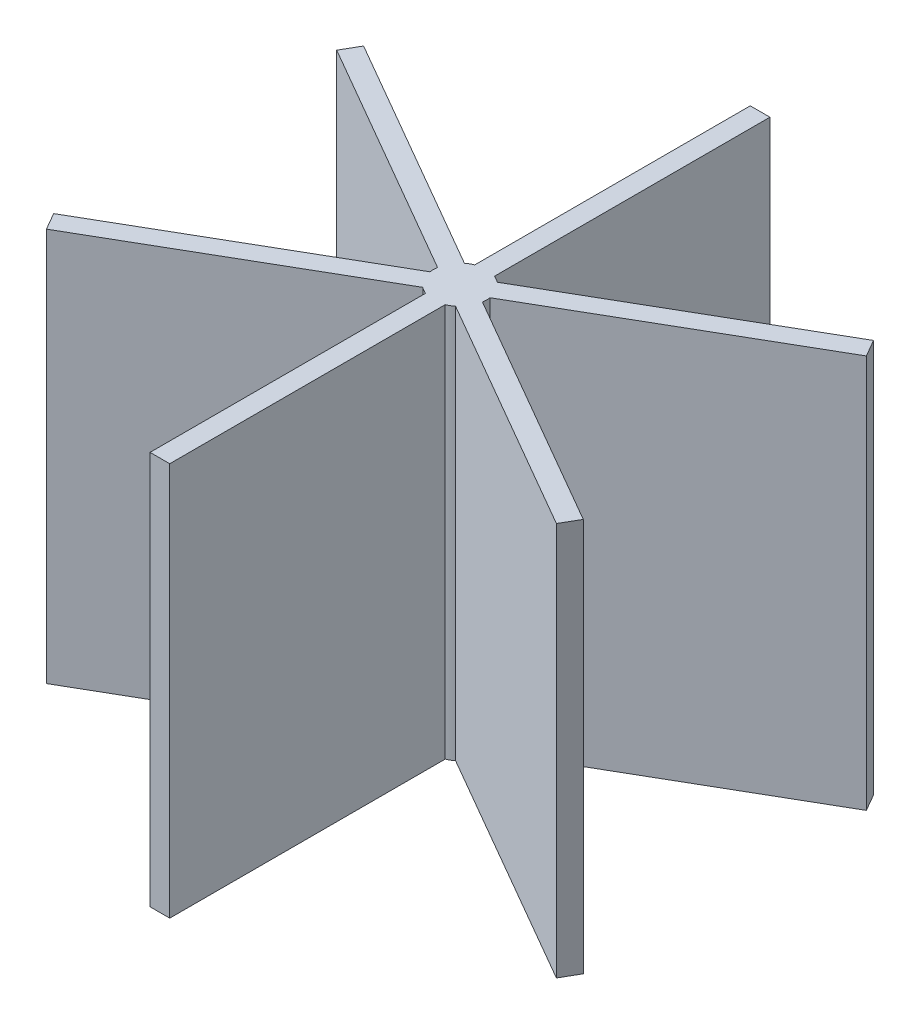
ISO-10303-21;
HEADER;
FILE_DESCRIPTION(('STEP AP214'),'2;1');
FILE_NAME('part.step','',(''),(''),'','','');
FILE_SCHEMA(('AUTOMOTIVE_DESIGN { 1 0 10303 214 1 1 1 1 }'));
ENDSEC;
DATA;
#1=APPLICATION_CONTEXT('core data for automotive mechanical design processes');
#2=APPLICATION_PROTOCOL_DEFINITION('international standard','automotive_design',2000,#1);
#3=PRODUCT_CONTEXT('',#1,'mechanical');
#4=PRODUCT('Part','Part','',(#3));
#5=PRODUCT_RELATED_PRODUCT_CATEGORY('part','',(#4));
#6=PRODUCT_DEFINITION_FORMATION('','',#4);
#7=PRODUCT_DEFINITION_CONTEXT('part definition',#1,'design');
#8=PRODUCT_DEFINITION('design','',#6,#7);
#9=PRODUCT_DEFINITION_SHAPE('','',#8);
#10=(LENGTH_UNIT() NAMED_UNIT(*) SI_UNIT(.MILLI.,.METRE.));
#11=(NAMED_UNIT(*) PLANE_ANGLE_UNIT() SI_UNIT($,.RADIAN.));
#12=(NAMED_UNIT(*) SI_UNIT($,.STERADIAN.) SOLID_ANGLE_UNIT());
#13=UNCERTAINTY_MEASURE_WITH_UNIT(LENGTH_MEASURE(1.E-05),#10,'distance_accuracy_value','');
#14=(GEOMETRIC_REPRESENTATION_CONTEXT(3) GLOBAL_UNCERTAINTY_ASSIGNED_CONTEXT((#13)) GLOBAL_UNIT_ASSIGNED_CONTEXT((#10,
#11,#12)) REPRESENTATION_CONTEXT('',''));
#15=CARTESIAN_POINT('',(0.,0.,0.));
#16=DIRECTION('',(0.,0.,1.));
#17=DIRECTION('',(1.,0.,0.));
#18=AXIS2_PLACEMENT_3D('',#15,#16,#17);
#19=CARTESIAN_POINT('',(0.,50.8,0.));
#20=DIRECTION('',(0.,-1.,0.));
#21=DIRECTION('',(0.,0.,-1.));
#22=AXIS2_PLACEMENT_3D('',#19,#20,#21);
#23=CYLINDRICAL_SURFACE('',#22,3.4195796525316);
#24=CARTESIAN_POINT('',(0.,0.,0.));
#25=DIRECTION('',(0.,1.,0.));
#26=DIRECTION('',(0.,0.,1.));
#27=AXIS2_PLACEMENT_3D('',#24,#25,#26);
#28=CIRCLE('',#27,3.4195796525316);
#29=CARTESIAN_POINT('',(-1.2699999999999,0.,-3.1750000000014));
#30=VERTEX_POINT('',#29);
#31=CARTESIAN_POINT('',(-2.11463065701598,0.,-2.68735226280735));
#32=VERTEX_POINT('',#31);
#33=EDGE_CURVE('E225',#30,#32,#28,.T.);
#34=ORIENTED_EDGE('',*,*,#33,.T.);
#35=DIRECTION('',(0.,-1.,0.));
#36=VECTOR('',#35,1.);
#37=CARTESIAN_POINT('',(-2.11463065701598,50.8,-2.68735226280735));
#38=LINE('',#37,#36);
#39=CARTESIAN_POINT('',(-2.11463065701598,50.8,-2.68735226280735));
#40=VERTEX_POINT('',#39);
#41=EDGE_CURVE('E11',#40,#32,#38,.T.);
#42=ORIENTED_EDGE('',*,*,#41,.F.);
#43=CARTESIAN_POINT('',(0.,50.8,0.));
#44=DIRECTION('',(0.,1.,0.));
#45=DIRECTION('',(0.,0.,1.));
#46=AXIS2_PLACEMENT_3D('',#43,#44,#45);
#47=CIRCLE('',#46,3.4195796525316);
#48=CARTESIAN_POINT('',(-1.2699999999999,50.8,-3.1750000000014));
#49=VERTEX_POINT('',#48);
#50=EDGE_CURVE('E271',#49,#40,#47,.T.);
#51=ORIENTED_EDGE('',*,*,#50,.F.);
#52=DIRECTION('',(0.,-1.,0.));
#53=VECTOR('',#52,1.);
#54=CARTESIAN_POINT('',(-1.2699999999999,50.8,-3.1750000000014));
#55=LINE('',#54,#53);
#56=EDGE_CURVE('E221',#49,#30,#55,.T.);
#57=ORIENTED_EDGE('',*,*,#56,.T.);
#58=EDGE_LOOP('',(#34,#42,#51,#57));
#59=FACE_BOUND('',#58,.T.);
#60=ADVANCED_FACE('F33',(#59),#23,.T.);
#61=CARTESIAN_POINT('',(-2.11463065701598,50.8,-2.68735226280735));
#62=DIRECTION('',(-0.499999999999999,0.,0.866025403784439));
#63=DIRECTION('',(0.866025403784439,0.,0.499999999999999));
#64=AXIS2_PLACEMENT_3D('',#61,#62,#63);
#65=PLANE('',#64);
#66=DIRECTION('',(-0.866025403784439,0.,-0.499999999999999));
#67=VECTOR('',#66,1.);
#68=CARTESIAN_POINT('',(-2.11463065701598,0.,-2.68735226280735));
#69=LINE('',#68,#67);
#70=CARTESIAN_POINT('',(-32.9104940155906,0.,-20.4673522628073));
#71=VERTEX_POINT('',#70);
#72=EDGE_CURVE('E228',#32,#71,#69,.T.);
#73=ORIENTED_EDGE('',*,*,#72,.T.);
#74=DIRECTION('',(0.,-1.,0.));
#75=VECTOR('',#74,1.);
#76=CARTESIAN_POINT('',(-32.9104940155906,50.8,-20.4673522628073));
#77=LINE('',#76,#75);
#78=CARTESIAN_POINT('',(-32.9104940155906,50.8,-20.4673522628073));
#79=VERTEX_POINT('',#78);
#80=EDGE_CURVE('E41',#79,#71,#77,.T.);
#81=ORIENTED_EDGE('',*,*,#80,.F.);
#82=DIRECTION('',(-0.866025403784439,0.,-0.499999999999999));
#83=VECTOR('',#82,1.);
#84=CARTESIAN_POINT('',(-2.11463065701598,50.8,-2.68735226280735));
#85=LINE('',#84,#83);
#86=EDGE_CURVE('E140',#40,#79,#85,.T.);
#87=ORIENTED_EDGE('',*,*,#86,.F.);
#88=ORIENTED_EDGE('',*,*,#41,.T.);
#89=EDGE_LOOP('',(#73,#81,#87,#88));
#90=FACE_BOUND('',#89,.T.);
#91=ADVANCED_FACE('F409',(#90),#65,.F.);
#92=CARTESIAN_POINT('',(-34.1804940155906,50.8,-18.2676477371948));
#93=DIRECTION('',(0.866025403784439,0.,0.5));
#94=DIRECTION('',(0.5,0.,-0.866025403784439));
#95=AXIS2_PLACEMENT_3D('',#92,#93,#94);
#96=PLANE('',#95);
#97=DIRECTION('',(-0.5,0.,0.866025403784439));
#98=VECTOR('',#97,1.);
#99=CARTESIAN_POINT('',(-34.1804940155906,0.,-18.2676477371948));
#100=LINE('',#99,#98);
#101=CARTESIAN_POINT('',(-34.1804940155906,0.,-18.2676477371948));
#102=VERTEX_POINT('',#101);
#103=EDGE_CURVE('E230',#71,#102,#100,.T.);
#104=ORIENTED_EDGE('',*,*,#103,.T.);
#105=DIRECTION('',(0.,-1.,0.));
#106=VECTOR('',#105,1.);
#107=CARTESIAN_POINT('',(-34.1804940155906,50.8,-18.2676477371948));
#108=LINE('',#107,#106);
#109=CARTESIAN_POINT('',(-34.1804940155906,50.8,-18.2676477371948));
#110=VERTEX_POINT('',#109);
#111=EDGE_CURVE('E326',#110,#102,#108,.T.);
#112=ORIENTED_EDGE('',*,*,#111,.F.);
#113=DIRECTION('',(-0.5,0.,0.866025403784439));
#114=VECTOR('',#113,1.);
#115=CARTESIAN_POINT('',(-34.1804940155906,50.8,-18.2676477371948));
#116=LINE('',#115,#114);
#117=EDGE_CURVE('E334',#79,#110,#116,.T.);
#118=ORIENTED_EDGE('',*,*,#117,.F.);
#119=ORIENTED_EDGE('',*,*,#80,.T.);
#120=EDGE_LOOP('',(#104,#112,#118,#119));
#121=FACE_BOUND('',#120,.T.);
#122=ADVANCED_FACE('F332',(#121),#96,.F.);
#123=CARTESIAN_POINT('',(-3.38463065701598,50.8,-0.487647737194882));
#124=DIRECTION('',(0.499999999999999,0.,-0.866025403784439));
#125=DIRECTION('',(-0.866025403784439,0.,-0.499999999999999));
#126=AXIS2_PLACEMENT_3D('',#123,#124,#125);
#127=PLANE('',#126);
#128=DIRECTION('',(0.866025403784439,0.,0.499999999999999));
#129=VECTOR('',#128,1.);
#130=CARTESIAN_POINT('',(-3.38463065701598,0.,-0.487647737194882));
#131=LINE('',#130,#129);
#132=CARTESIAN_POINT('',(-3.38463065701587,0.,-0.487647737194866));
#133=VERTEX_POINT('',#132);
#134=EDGE_CURVE('E232',#102,#133,#131,.T.);
#135=ORIENTED_EDGE('',*,*,#134,.T.);
#136=DIRECTION('',(0.,-1.,0.));
#137=VECTOR('',#136,1.);
#138=CARTESIAN_POINT('',(-3.38463065701587,50.8,-0.487647737194866));
#139=LINE('',#138,#137);
#140=CARTESIAN_POINT('',(-3.38463065701587,50.8,-0.487647737194866));
#141=VERTEX_POINT('',#140);
#142=EDGE_CURVE('E323',#141,#133,#139,.T.);
#143=ORIENTED_EDGE('',*,*,#142,.F.);
#144=DIRECTION('',(0.866025403784439,0.,0.499999999999999));
#145=VECTOR('',#144,1.);
#146=CARTESIAN_POINT('',(-3.38463065701598,50.8,-0.487647737194882));
#147=LINE('',#146,#145);
#148=EDGE_CURVE('E352',#110,#141,#147,.T.);
#149=ORIENTED_EDGE('',*,*,#148,.F.);
#150=ORIENTED_EDGE('',*,*,#111,.T.);
#151=EDGE_LOOP('',(#135,#143,#149,#150));
#152=FACE_BOUND('',#151,.T.);
#153=ADVANCED_FACE('F343',(#152),#127,.F.);
#154=CARTESIAN_POINT('',(0.,50.8,0.));
#155=DIRECTION('',(0.,-1.,0.));
#156=DIRECTION('',(0.,0.,-1.));
#157=AXIS2_PLACEMENT_3D('',#154,#155,#156);
#158=CYLINDRICAL_SURFACE('',#157,3.41957965253084);
#159=CARTESIAN_POINT('',(0.,0.,0.));
#160=DIRECTION('',(0.,1.,0.));
#161=DIRECTION('',(0.,0.,1.));
#162=AXIS2_PLACEMENT_3D('',#159,#160,#161);
#163=CIRCLE('',#162,3.41957965253084);
#164=CARTESIAN_POINT('',(-3.38463065701598,0.,0.487647737193217));
#165=VERTEX_POINT('',#164);
#166=EDGE_CURVE('E234',#133,#165,#163,.T.);
#167=ORIENTED_EDGE('',*,*,#166,.T.);
#168=DIRECTION('',(0.,-1.,0.));
#169=VECTOR('',#168,1.);
#170=CARTESIAN_POINT('',(-3.38463065701598,50.8,0.487647737193217));
#171=LINE('',#170,#169);
#172=CARTESIAN_POINT('',(-3.38463065701598,50.8,0.487647737193217));
#173=VERTEX_POINT('',#172);
#174=EDGE_CURVE('E320',#173,#165,#171,.T.);
#175=ORIENTED_EDGE('',*,*,#174,.F.);
#176=CARTESIAN_POINT('',(0.,50.8,0.));
#177=DIRECTION('',(0.,1.,0.));
#178=DIRECTION('',(0.,0.,1.));
#179=AXIS2_PLACEMENT_3D('',#176,#177,#178);
#180=CIRCLE('',#179,3.41957965253084);
#181=EDGE_CURVE('E349',#141,#173,#180,.T.);
#182=ORIENTED_EDGE('',*,*,#181,.F.);
#183=ORIENTED_EDGE('',*,*,#142,.T.);
#184=EDGE_LOOP('',(#167,#175,#182,#183));
#185=FACE_BOUND('',#184,.T.);
#186=ADVANCED_FACE('F347',(#185),#158,.T.);
#187=CARTESIAN_POINT('',(-3.38463065701598,50.8,0.487647737193217));
#188=DIRECTION('',(0.5,0.,0.866025403784438));
#189=DIRECTION('',(0.866025403784438,0.,-0.500000000000001));
#190=AXIS2_PLACEMENT_3D('',#187,#188,#189);
#191=PLANE('',#190);
#192=DIRECTION('',(-0.866025403784438,0.,0.5));
#193=VECTOR('',#192,1.);
#194=CARTESIAN_POINT('',(-3.38463065701598,0.,0.487647737193217));
#195=LINE('',#194,#193);
#196=CARTESIAN_POINT('',(-34.1804940155906,0.,18.2676477371932));
#197=VERTEX_POINT('',#196);
#198=EDGE_CURVE('E236',#165,#197,#195,.T.);
#199=ORIENTED_EDGE('',*,*,#198,.T.);
#200=DIRECTION('',(0.,-1.,0.));
#201=VECTOR('',#200,1.);
#202=CARTESIAN_POINT('',(-34.1804940155906,50.8,18.2676477371932));
#203=LINE('',#202,#201);
#204=CARTESIAN_POINT('',(-34.1804940155906,50.8,18.2676477371932));
#205=VERTEX_POINT('',#204);
#206=EDGE_CURVE('E317',#205,#197,#203,.T.);
#207=ORIENTED_EDGE('',*,*,#206,.F.);
#208=DIRECTION('',(-0.866025403784438,0.,0.5));
#209=VECTOR('',#208,1.);
#210=CARTESIAN_POINT('',(-3.38463065701598,50.8,0.487647737193217));
#211=LINE('',#210,#209);
#212=EDGE_CURVE('E351',#173,#205,#211,.T.);
#213=ORIENTED_EDGE('',*,*,#212,.F.);
#214=ORIENTED_EDGE('',*,*,#174,.T.);
#215=EDGE_LOOP('',(#199,#207,#213,#214));
#216=FACE_BOUND('',#215,.T.);
#217=ADVANCED_FACE('F422',(#216),#191,.F.);
#218=CARTESIAN_POINT('',(-32.9104940155906,50.8,20.4673522628057));
#219=DIRECTION('',(0.866025403784439,0.,-0.5));
#220=DIRECTION('',(-0.5,0.,-0.866025403784439));
#221=AXIS2_PLACEMENT_3D('',#218,#219,#220);
#222=PLANE('',#221);
#223=DIRECTION('',(0.5,0.,0.866025403784439));
#224=VECTOR('',#223,1.);
#225=CARTESIAN_POINT('',(-32.9104940155906,0.,20.4673522628057));
#226=LINE('',#225,#224);
#227=CARTESIAN_POINT('',(-32.9104940155906,0.,20.4673522628057));
#228=VERTEX_POINT('',#227);
#229=EDGE_CURVE('E238',#197,#228,#226,.T.);
#230=ORIENTED_EDGE('',*,*,#229,.T.);
#231=DIRECTION('',(0.,-1.,0.));
#232=VECTOR('',#231,1.);
#233=CARTESIAN_POINT('',(-32.9104940155906,50.8,20.4673522628057));
#234=LINE('',#233,#232);
#235=CARTESIAN_POINT('',(-32.9104940155906,50.8,20.4673522628057));
#236=VERTEX_POINT('',#235);
#237=EDGE_CURVE('E314',#236,#228,#234,.T.);
#238=ORIENTED_EDGE('',*,*,#237,.F.);
#239=DIRECTION('',(0.5,0.,0.866025403784439));
#240=VECTOR('',#239,1.);
#241=CARTESIAN_POINT('',(-32.9104940155906,50.8,20.4673522628057));
#242=LINE('',#241,#240);
#243=EDGE_CURVE('E354',#205,#236,#242,.T.);
#244=ORIENTED_EDGE('',*,*,#243,.F.);
#245=ORIENTED_EDGE('',*,*,#206,.T.);
#246=EDGE_LOOP('',(#230,#238,#244,#245));
#247=FACE_BOUND('',#246,.T.);
#248=ADVANCED_FACE('F425',(#247),#222,.F.);
#249=CARTESIAN_POINT('',(-2.11463065701598,50.8,2.68735226280569));
#250=DIRECTION('',(-0.5,0.,-0.866025403784438));
#251=DIRECTION('',(-0.866025403784438,0.,0.500000000000001));
#252=AXIS2_PLACEMENT_3D('',#249,#250,#251);
#253=PLANE('',#252);
#254=DIRECTION('',(0.866025403784438,0.,-0.5));
#255=VECTOR('',#254,1.);
#256=CARTESIAN_POINT('',(-2.11463065701598,0.,2.68735226280569));
#257=LINE('',#256,#255);
#258=CARTESIAN_POINT('',(-2.11463065701595,0.,2.68735226280565));
#259=VERTEX_POINT('',#258);
#260=EDGE_CURVE('E240',#228,#259,#257,.T.);
#261=ORIENTED_EDGE('',*,*,#260,.T.);
#262=DIRECTION('',(0.,-1.,0.));
#263=VECTOR('',#262,1.);
#264=CARTESIAN_POINT('',(-2.11463065701595,50.8,2.68735226280565));
#265=LINE('',#264,#263);
#266=CARTESIAN_POINT('',(-2.11463065701595,50.8,2.68735226280565));
#267=VERTEX_POINT('',#266);
#268=EDGE_CURVE('E311',#267,#259,#265,.T.);
#269=ORIENTED_EDGE('',*,*,#268,.F.);
#270=DIRECTION('',(0.866025403784438,0.,-0.5));
#271=VECTOR('',#270,1.);
#272=CARTESIAN_POINT('',(-2.11463065701598,50.8,2.68735226280569));
#273=LINE('',#272,#271);
#274=EDGE_CURVE('E360',#236,#267,#273,.T.);
#275=ORIENTED_EDGE('',*,*,#274,.F.);
#276=ORIENTED_EDGE('',*,*,#237,.T.);
#277=EDGE_LOOP('',(#261,#269,#275,#276));
#278=FACE_BOUND('',#277,.T.);
#279=ADVANCED_FACE('F429',(#278),#253,.F.);
#280=CARTESIAN_POINT('',(0.,50.8,0.));
#281=DIRECTION('',(0.,-1.,0.));
#282=DIRECTION('',(0.,0.,-1.));
#283=AXIS2_PLACEMENT_3D('',#280,#281,#282);
#284=CYLINDRICAL_SURFACE('',#283,3.41957965253017);
#285=CARTESIAN_POINT('',(0.,0.,0.));
#286=DIRECTION('',(0.,1.,0.));
#287=DIRECTION('',(0.,0.,1.));
#288=AXIS2_PLACEMENT_3D('',#285,#286,#287);
#289=CIRCLE('',#288,3.41957965253017);
#290=CARTESIAN_POINT('',(-1.2699999999999,0.,3.17499999999973));
#291=VERTEX_POINT('',#290);
#292=EDGE_CURVE('E242',#259,#291,#289,.T.);
#293=ORIENTED_EDGE('',*,*,#292,.T.);
#294=DIRECTION('',(0.,-1.,0.));
#295=VECTOR('',#294,1.);
#296=CARTESIAN_POINT('',(-1.2699999999999,50.8,3.17499999999973));
#297=LINE('',#296,#295);
#298=CARTESIAN_POINT('',(-1.2699999999999,50.8,3.17499999999973));
#299=VERTEX_POINT('',#298);
#300=EDGE_CURVE('E308',#299,#291,#297,.T.);
#301=ORIENTED_EDGE('',*,*,#300,.F.);
#302=CARTESIAN_POINT('',(0.,50.8,0.));
#303=DIRECTION('',(0.,1.,0.));
#304=DIRECTION('',(0.,0.,1.));
#305=AXIS2_PLACEMENT_3D('',#302,#303,#304);
#306=CIRCLE('',#305,3.41957965253017);
#307=EDGE_CURVE('E362',#267,#299,#306,.T.);
#308=ORIENTED_EDGE('',*,*,#307,.F.);
#309=ORIENTED_EDGE('',*,*,#268,.T.);
#310=EDGE_LOOP('',(#293,#301,#308,#309));
#311=FACE_BOUND('',#310,.T.);
#312=ADVANCED_FACE('F433',(#311),#284,.T.);
#313=CARTESIAN_POINT('',(-1.2699999999999,50.8,3.17499999999973));
#314=DIRECTION('',(1.,0.,0.));
#315=DIRECTION('',(0.,0.,-1.));
#316=AXIS2_PLACEMENT_3D('',#313,#314,#315);
#317=PLANE('',#316);
#318=DIRECTION('',(0.,0.,1.));
#319=VECTOR('',#318,1.);
#320=CARTESIAN_POINT('',(-1.2699999999999,0.,3.17499999999973));
#321=LINE('',#320,#319);
#322=CARTESIAN_POINT('',(-1.26999999999988,0.,38.7349999999997));
#323=VERTEX_POINT('',#322);
#324=EDGE_CURVE('E244',#291,#323,#321,.T.);
#325=ORIENTED_EDGE('',*,*,#324,.T.);
#326=DIRECTION('',(0.,-1.,0.));
#327=VECTOR('',#326,1.);
#328=CARTESIAN_POINT('',(-1.26999999999988,50.8,38.7349999999997));
#329=LINE('',#328,#327);
#330=CARTESIAN_POINT('',(-1.26999999999988,50.8,38.7349999999997));
#331=VERTEX_POINT('',#330);
#332=EDGE_CURVE('E305',#331,#323,#329,.T.);
#333=ORIENTED_EDGE('',*,*,#332,.F.);
#334=DIRECTION('',(0.,0.,1.));
#335=VECTOR('',#334,1.);
#336=CARTESIAN_POINT('',(-1.2699999999999,50.8,3.17499999999973));
#337=LINE('',#336,#335);
#338=EDGE_CURVE('E364',#299,#331,#337,.T.);
#339=ORIENTED_EDGE('',*,*,#338,.F.);
#340=ORIENTED_EDGE('',*,*,#300,.T.);
#341=EDGE_LOOP('',(#325,#333,#339,#340));
#342=FACE_BOUND('',#341,.T.);
#343=ADVANCED_FACE('F437',(#342),#317,.F.);
#344=CARTESIAN_POINT('',(1.27000000000008,50.8,38.7349999999997));
#345=DIRECTION('',(0.,0.,-1.));
#346=DIRECTION('',(-1.,0.,0.));
#347=AXIS2_PLACEMENT_3D('',#344,#345,#346);
#348=PLANE('',#347);
#349=DIRECTION('',(1.,0.,0.));
#350=VECTOR('',#349,1.);
#351=CARTESIAN_POINT('',(1.27000000000008,0.,38.7349999999997));
#352=LINE('',#351,#350);
#353=CARTESIAN_POINT('',(1.27000000000008,0.,38.7349999999997));
#354=VERTEX_POINT('',#353);
#355=EDGE_CURVE('E246',#323,#354,#352,.T.);
#356=ORIENTED_EDGE('',*,*,#355,.T.);
#357=DIRECTION('',(0.,-1.,0.));
#358=VECTOR('',#357,1.);
#359=CARTESIAN_POINT('',(1.27000000000008,50.8,38.7349999999997));
#360=LINE('',#359,#358);
#361=CARTESIAN_POINT('',(1.27000000000008,50.8,38.7349999999997));
#362=VERTEX_POINT('',#361);
#363=EDGE_CURVE('E302',#362,#354,#360,.T.);
#364=ORIENTED_EDGE('',*,*,#363,.F.);
#365=DIRECTION('',(1.,0.,0.));
#366=VECTOR('',#365,1.);
#367=CARTESIAN_POINT('',(1.27000000000008,50.8,38.7349999999997));
#368=LINE('',#367,#366);
#369=EDGE_CURVE('E366',#331,#362,#368,.T.);
#370=ORIENTED_EDGE('',*,*,#369,.F.);
#371=ORIENTED_EDGE('',*,*,#332,.T.);
#372=EDGE_LOOP('',(#356,#364,#370,#371));
#373=FACE_BOUND('',#372,.T.);
#374=ADVANCED_FACE('F441',(#373),#348,.F.);
#375=CARTESIAN_POINT('',(1.2700000000001,50.8,3.17499999999973));
#376=DIRECTION('',(-1.,0.,0.));
#377=DIRECTION('',(0.,0.,1.));
#378=AXIS2_PLACEMENT_3D('',#375,#376,#377);
#379=PLANE('',#378);
#380=DIRECTION('',(0.,0.,-1.));
#381=VECTOR('',#380,1.);
#382=CARTESIAN_POINT('',(1.2700000000001,0.,3.17499999999973));
#383=LINE('',#382,#381);
#384=CARTESIAN_POINT('',(1.27000000000013,0.,3.1749999999998));
#385=VERTEX_POINT('',#384);
#386=EDGE_CURVE('E248',#354,#385,#383,.T.);
#387=ORIENTED_EDGE('',*,*,#386,.T.);
#388=DIRECTION('',(0.,-1.,0.));
#389=VECTOR('',#388,1.);
#390=CARTESIAN_POINT('',(1.27000000000013,50.8,3.1749999999998));
#391=LINE('',#390,#389);
#392=CARTESIAN_POINT('',(1.27000000000013,50.8,3.1749999999998));
#393=VERTEX_POINT('',#392);
#394=EDGE_CURVE('E299',#393,#385,#391,.T.);
#395=ORIENTED_EDGE('',*,*,#394,.F.);
#396=DIRECTION('',(0.,0.,-1.));
#397=VECTOR('',#396,1.);
#398=CARTESIAN_POINT('',(1.2700000000001,50.8,3.17499999999973));
#399=LINE('',#398,#397);
#400=EDGE_CURVE('E368',#362,#393,#399,.T.);
#401=ORIENTED_EDGE('',*,*,#400,.F.);
#402=ORIENTED_EDGE('',*,*,#363,.T.);
#403=EDGE_LOOP('',(#387,#395,#401,#402));
#404=FACE_BOUND('',#403,.T.);
#405=ADVANCED_FACE('F445',(#404),#379,.F.);
#406=CARTESIAN_POINT('',(0.,50.8,0.));
#407=DIRECTION('',(0.,-1.,0.));
#408=DIRECTION('',(0.,0.,-1.));
#409=AXIS2_PLACEMENT_3D('',#406,#407,#408);
#410=CYLINDRICAL_SURFACE('',#409,3.41957965253027);
#411=CARTESIAN_POINT('',(0.,0.,0.));
#412=DIRECTION('',(0.,1.,0.));
#413=DIRECTION('',(0.,0.,1.));
#414=AXIS2_PLACEMENT_3D('',#411,#412,#413);
#415=CIRCLE('',#414,3.41957965253027);
#416=CARTESIAN_POINT('',(2.11463065701618,0.,2.68735226280569));
#417=VERTEX_POINT('',#416);
#418=EDGE_CURVE('E250',#385,#417,#415,.T.);
#419=ORIENTED_EDGE('',*,*,#418,.T.);
#420=DIRECTION('',(0.,-1.,0.));
#421=VECTOR('',#420,1.);
#422=CARTESIAN_POINT('',(2.11463065701618,50.8,2.68735226280569));
#423=LINE('',#422,#421);
#424=CARTESIAN_POINT('',(2.11463065701618,50.8,2.68735226280569));
#425=VERTEX_POINT('',#424);
#426=EDGE_CURVE('E296',#425,#417,#423,.T.);
#427=ORIENTED_EDGE('',*,*,#426,.F.);
#428=CARTESIAN_POINT('',(0.,50.8,0.));
#429=DIRECTION('',(0.,1.,0.));
#430=DIRECTION('',(0.,0.,1.));
#431=AXIS2_PLACEMENT_3D('',#428,#429,#430);
#432=CIRCLE('',#431,3.41957965253027);
#433=EDGE_CURVE('E370',#393,#425,#432,.T.);
#434=ORIENTED_EDGE('',*,*,#433,.F.);
#435=ORIENTED_EDGE('',*,*,#394,.T.);
#436=EDGE_LOOP('',(#419,#427,#434,#435));
#437=FACE_BOUND('',#436,.T.);
#438=ADVANCED_FACE('F449',(#437),#410,.T.);
#439=CARTESIAN_POINT('',(2.11463065701618,50.8,2.68735226280569));
#440=DIRECTION('',(0.5,0.,-0.866025403784439));
#441=DIRECTION('',(-0.866025403784439,0.,-0.5));
#442=AXIS2_PLACEMENT_3D('',#439,#440,#441);
#443=PLANE('',#442);
#444=DIRECTION('',(0.866025403784439,0.,0.5));
#445=VECTOR('',#444,1.);
#446=CARTESIAN_POINT('',(2.11463065701618,0.,2.68735226280569));
#447=LINE('',#446,#445);
#448=CARTESIAN_POINT('',(32.9104940155908,0.,20.4673522628057));
#449=VERTEX_POINT('',#448);
#450=EDGE_CURVE('E252',#417,#449,#447,.T.);
#451=ORIENTED_EDGE('',*,*,#450,.T.);
#452=DIRECTION('',(0.,-1.,0.));
#453=VECTOR('',#452,1.);
#454=CARTESIAN_POINT('',(32.9104940155908,50.8,20.4673522628057));
#455=LINE('',#454,#453);
#456=CARTESIAN_POINT('',(32.9104940155908,50.8,20.4673522628057));
#457=VERTEX_POINT('',#456);
#458=EDGE_CURVE('E293',#457,#449,#455,.T.);
#459=ORIENTED_EDGE('',*,*,#458,.F.);
#460=DIRECTION('',(0.866025403784439,0.,0.5));
#461=VECTOR('',#460,1.);
#462=CARTESIAN_POINT('',(2.11463065701618,50.8,2.68735226280569));
#463=LINE('',#462,#461);
#464=EDGE_CURVE('E372',#425,#457,#463,.T.);
#465=ORIENTED_EDGE('',*,*,#464,.F.);
#466=ORIENTED_EDGE('',*,*,#426,.T.);
#467=EDGE_LOOP('',(#451,#459,#465,#466));
#468=FACE_BOUND('',#467,.T.);
#469=ADVANCED_FACE('F453',(#468),#443,.F.);
#470=CARTESIAN_POINT('',(34.1804940155908,50.8,18.2676477371932));
#471=DIRECTION('',(-0.866025403784439,0.,-0.5));
#472=DIRECTION('',(-0.5,0.,0.866025403784439));
#473=AXIS2_PLACEMENT_3D('',#470,#471,#472);
#474=PLANE('',#473);
#475=DIRECTION('',(0.5,0.,-0.866025403784439));
#476=VECTOR('',#475,1.);
#477=CARTESIAN_POINT('',(34.1804940155908,0.,18.2676477371932));
#478=LINE('',#477,#476);
#479=CARTESIAN_POINT('',(34.1804940155908,0.,18.2676477371932));
#480=VERTEX_POINT('',#479);
#481=EDGE_CURVE('E254',#449,#480,#478,.T.);
#482=ORIENTED_EDGE('',*,*,#481,.T.);
#483=DIRECTION('',(0.,-1.,0.));
#484=VECTOR('',#483,1.);
#485=CARTESIAN_POINT('',(34.1804940155908,50.8,18.2676477371932));
#486=LINE('',#485,#484);
#487=CARTESIAN_POINT('',(34.1804940155908,50.8,18.2676477371932));
#488=VERTEX_POINT('',#487);
#489=EDGE_CURVE('E290',#488,#480,#486,.T.);
#490=ORIENTED_EDGE('',*,*,#489,.F.);
#491=DIRECTION('',(0.5,0.,-0.866025403784439));
#492=VECTOR('',#491,1.);
#493=CARTESIAN_POINT('',(34.1804940155908,50.8,18.2676477371932));
#494=LINE('',#493,#492);
#495=EDGE_CURVE('E374',#457,#488,#494,.T.);
#496=ORIENTED_EDGE('',*,*,#495,.F.);
#497=ORIENTED_EDGE('',*,*,#458,.T.);
#498=EDGE_LOOP('',(#482,#490,#496,#497));
#499=FACE_BOUND('',#498,.T.);
#500=ADVANCED_FACE('F457',(#499),#474,.F.);
#501=CARTESIAN_POINT('',(3.38463065701619,50.8,0.487647737193217));
#502=DIRECTION('',(-0.5,0.,0.866025403784439));
#503=DIRECTION('',(0.866025403784439,0.,0.5));
#504=AXIS2_PLACEMENT_3D('',#501,#502,#503);
#505=PLANE('',#504);
#506=DIRECTION('',(-0.866025403784439,0.,-0.5));
#507=VECTOR('',#506,1.);
#508=CARTESIAN_POINT('',(3.38463065701619,0.,0.487647737193217));
#509=LINE('',#508,#507);
#510=CARTESIAN_POINT('',(3.3846306570163,0.,0.487647737193234));
#511=VERTEX_POINT('',#510);
#512=EDGE_CURVE('E256',#480,#511,#509,.T.);
#513=ORIENTED_EDGE('',*,*,#512,.T.);
#514=DIRECTION('',(0.,-1.,0.));
#515=VECTOR('',#514,1.);
#516=CARTESIAN_POINT('',(3.3846306570163,50.8,0.487647737193234));
#517=LINE('',#516,#515);
#518=CARTESIAN_POINT('',(3.3846306570163,50.8,0.487647737193234));
#519=VERTEX_POINT('',#518);
#520=EDGE_CURVE('E287',#519,#511,#517,.T.);
#521=ORIENTED_EDGE('',*,*,#520,.F.);
#522=DIRECTION('',(-0.866025403784439,0.,-0.5));
#523=VECTOR('',#522,1.);
#524=CARTESIAN_POINT('',(3.38463065701619,50.8,0.487647737193217));
#525=LINE('',#524,#523);
#526=EDGE_CURVE('E376',#488,#519,#525,.T.);
#527=ORIENTED_EDGE('',*,*,#526,.F.);
#528=ORIENTED_EDGE('',*,*,#489,.T.);
#529=EDGE_LOOP('',(#513,#521,#527,#528));
#530=FACE_BOUND('',#529,.T.);
#531=ADVANCED_FACE('F461',(#530),#505,.F.);
#532=CARTESIAN_POINT('',(0.,50.8,0.));
#533=DIRECTION('',(0.,-1.,0.));
#534=DIRECTION('',(0.,0.,-1.));
#535=AXIS2_PLACEMENT_3D('',#532,#533,#534);
#536=CYLINDRICAL_SURFACE('',#535,3.41957965253104);
#537=CARTESIAN_POINT('',(0.,0.,0.));
#538=DIRECTION('',(0.,1.,0.));
#539=DIRECTION('',(0.,0.,1.));
#540=AXIS2_PLACEMENT_3D('',#537,#538,#539);
#541=CIRCLE('',#540,3.41957965253104);
#542=CARTESIAN_POINT('',(3.38463065701619,0.,-0.487647737194882));
#543=VERTEX_POINT('',#542);
#544=EDGE_CURVE('E258',#511,#543,#541,.T.);
#545=ORIENTED_EDGE('',*,*,#544,.T.);
#546=DIRECTION('',(0.,-1.,0.));
#547=VECTOR('',#546,1.);
#548=CARTESIAN_POINT('',(3.38463065701619,50.8,-0.487647737194882));
#549=LINE('',#548,#547);
#550=CARTESIAN_POINT('',(3.38463065701619,50.8,-0.487647737194882));
#551=VERTEX_POINT('',#550);
#552=EDGE_CURVE('E284',#551,#543,#549,.T.);
#553=ORIENTED_EDGE('',*,*,#552,.F.);
#554=CARTESIAN_POINT('',(0.,50.8,0.));
#555=DIRECTION('',(0.,1.,0.));
#556=DIRECTION('',(0.,0.,1.));
#557=AXIS2_PLACEMENT_3D('',#554,#555,#556);
#558=CIRCLE('',#557,3.41957965253104);
#559=EDGE_CURVE('E378',#519,#551,#558,.T.);
#560=ORIENTED_EDGE('',*,*,#559,.F.);
#561=ORIENTED_EDGE('',*,*,#520,.T.);
#562=EDGE_LOOP('',(#545,#553,#560,#561));
#563=FACE_BOUND('',#562,.T.);
#564=ADVANCED_FACE('F465',(#563),#536,.T.);
#565=CARTESIAN_POINT('',(3.38463065701619,50.8,-0.487647737194882));
#566=DIRECTION('',(-0.5,0.,-0.866025403784438));
#567=DIRECTION('',(-0.866025403784439,0.,0.5));
#568=AXIS2_PLACEMENT_3D('',#565,#566,#567);
#569=PLANE('',#568);
#570=DIRECTION('',(0.866025403784438,0.,-0.5));
#571=VECTOR('',#570,1.);
#572=CARTESIAN_POINT('',(3.38463065701619,0.,-0.487647737194882));
#573=LINE('',#572,#571);
#574=CARTESIAN_POINT('',(34.1804940155908,0.,-18.2676477371949));
#575=VERTEX_POINT('',#574);
#576=EDGE_CURVE('E260',#543,#575,#573,.T.);
#577=ORIENTED_EDGE('',*,*,#576,.T.);
#578=DIRECTION('',(0.,-1.,0.));
#579=VECTOR('',#578,1.);
#580=CARTESIAN_POINT('',(34.1804940155908,50.8,-18.2676477371949));
#581=LINE('',#580,#579);
#582=CARTESIAN_POINT('',(34.1804940155908,50.8,-18.2676477371949));
#583=VERTEX_POINT('',#582);
#584=EDGE_CURVE('E281',#583,#575,#581,.T.);
#585=ORIENTED_EDGE('',*,*,#584,.F.);
#586=DIRECTION('',(0.866025403784438,0.,-0.5));
#587=VECTOR('',#586,1.);
#588=CARTESIAN_POINT('',(3.38463065701619,50.8,-0.487647737194882));
#589=LINE('',#588,#587);
#590=EDGE_CURVE('E380',#551,#583,#589,.T.);
#591=ORIENTED_EDGE('',*,*,#590,.F.);
#592=ORIENTED_EDGE('',*,*,#552,.T.);
#593=EDGE_LOOP('',(#577,#585,#591,#592));
#594=FACE_BOUND('',#593,.T.);
#595=ADVANCED_FACE('F469',(#594),#569,.F.);
#596=CARTESIAN_POINT('',(32.9104940155908,50.8,-20.4673522628074));
#597=DIRECTION('',(-0.86602540378444,0.,0.499999999999998));
#598=DIRECTION('',(0.499999999999998,0.,0.86602540378444));
#599=AXIS2_PLACEMENT_3D('',#596,#597,#598);
#600=PLANE('',#599);
#601=DIRECTION('',(-0.499999999999998,0.,-0.86602540378444));
#602=VECTOR('',#601,1.);
#603=CARTESIAN_POINT('',(32.9104940155908,0.,-20.4673522628074));
#604=LINE('',#603,#602);
#605=CARTESIAN_POINT('',(32.9104940155908,0.,-20.4673522628074));
#606=VERTEX_POINT('',#605);
#607=EDGE_CURVE('E262',#575,#606,#604,.T.);
#608=ORIENTED_EDGE('',*,*,#607,.T.);
#609=DIRECTION('',(0.,-1.,0.));
#610=VECTOR('',#609,1.);
#611=CARTESIAN_POINT('',(32.9104940155908,50.8,-20.4673522628074));
#612=LINE('',#611,#610);
#613=CARTESIAN_POINT('',(32.9104940155908,50.8,-20.4673522628074));
#614=VERTEX_POINT('',#613);
#615=EDGE_CURVE('E278',#614,#606,#612,.T.);
#616=ORIENTED_EDGE('',*,*,#615,.F.);
#617=DIRECTION('',(-0.499999999999998,0.,-0.86602540378444));
#618=VECTOR('',#617,1.);
#619=CARTESIAN_POINT('',(32.9104940155908,50.8,-20.4673522628074));
#620=LINE('',#619,#618);
#621=EDGE_CURVE('E382',#583,#614,#620,.T.);
#622=ORIENTED_EDGE('',*,*,#621,.F.);
#623=ORIENTED_EDGE('',*,*,#584,.T.);
#624=EDGE_LOOP('',(#608,#616,#622,#623));
#625=FACE_BOUND('',#624,.T.);
#626=ADVANCED_FACE('F473',(#625),#600,.F.);
#627=CARTESIAN_POINT('',(2.11463065701618,50.8,-2.68735226280735));
#628=DIRECTION('',(0.5,0.,0.866025403784438));
#629=DIRECTION('',(0.866025403784439,0.,-0.5));
#630=AXIS2_PLACEMENT_3D('',#627,#628,#629);
#631=PLANE('',#630);
#632=DIRECTION('',(-0.866025403784438,0.,0.5));
#633=VECTOR('',#632,1.);
#634=CARTESIAN_POINT('',(2.11463065701618,0.,-2.68735226280735));
#635=LINE('',#634,#633);
#636=CARTESIAN_POINT('',(2.11463065701621,0.,-2.68735226280739));
#637=VERTEX_POINT('',#636);
#638=EDGE_CURVE('E264',#606,#637,#635,.T.);
#639=ORIENTED_EDGE('',*,*,#638,.T.);
#640=DIRECTION('',(0.,-1.,0.));
#641=VECTOR('',#640,1.);
#642=CARTESIAN_POINT('',(2.11463065701621,50.8,-2.68735226280739));
#643=LINE('',#642,#641);
#644=CARTESIAN_POINT('',(2.11463065701621,50.8,-2.68735226280739));
#645=VERTEX_POINT('',#644);
#646=EDGE_CURVE('E275',#645,#637,#643,.T.);
#647=ORIENTED_EDGE('',*,*,#646,.F.);
#648=DIRECTION('',(-0.866025403784438,0.,0.5));
#649=VECTOR('',#648,1.);
#650=CARTESIAN_POINT('',(2.11463065701618,50.8,-2.68735226280735));
#651=LINE('',#650,#649);
#652=EDGE_CURVE('E384',#614,#645,#651,.T.);
#653=ORIENTED_EDGE('',*,*,#652,.F.);
#654=ORIENTED_EDGE('',*,*,#615,.T.);
#655=EDGE_LOOP('',(#639,#647,#653,#654));
#656=FACE_BOUND('',#655,.T.);
#657=ADVANCED_FACE('F390',(#656),#631,.F.);
#658=CARTESIAN_POINT('',(0.,50.8,0.));
#659=DIRECTION('',(0.,-1.,0.));
#660=DIRECTION('',(0.,0.,-1.));
#661=AXIS2_PLACEMENT_3D('',#658,#659,#660);
#662=CYLINDRICAL_SURFACE('',#661,3.4195796525317);
#663=CARTESIAN_POINT('',(0.,0.,0.));
#664=DIRECTION('',(0.,1.,0.));
#665=DIRECTION('',(0.,0.,1.));
#666=AXIS2_PLACEMENT_3D('',#663,#664,#665);
#667=CIRCLE('',#666,3.4195796525317);
#668=CARTESIAN_POINT('',(1.2700000000001,0.,-3.1750000000014));
#669=VERTEX_POINT('',#668);
#670=EDGE_CURVE('E266',#637,#669,#667,.T.);
#671=ORIENTED_EDGE('',*,*,#670,.T.);
#672=DIRECTION('',(0.,-1.,0.));
#673=VECTOR('',#672,1.);
#674=CARTESIAN_POINT('',(1.2700000000001,50.8,-3.1750000000014));
#675=LINE('',#674,#673);
#676=CARTESIAN_POINT('',(1.2700000000001,50.8,-3.1750000000014));
#677=VERTEX_POINT('',#676);
#678=EDGE_CURVE('E216',#677,#669,#675,.T.);
#679=ORIENTED_EDGE('',*,*,#678,.F.);
#680=CARTESIAN_POINT('',(0.,50.8,0.));
#681=DIRECTION('',(0.,1.,0.));
#682=DIRECTION('',(0.,0.,1.));
#683=AXIS2_PLACEMENT_3D('',#680,#681,#682);
#684=CIRCLE('',#683,3.4195796525317);
#685=EDGE_CURVE('E207',#645,#677,#684,.T.);
#686=ORIENTED_EDGE('',*,*,#685,.F.);
#687=ORIENTED_EDGE('',*,*,#646,.T.);
#688=EDGE_LOOP('',(#671,#679,#686,#687));
#689=FACE_BOUND('',#688,.T.);
#690=ADVANCED_FACE('F394',(#689),#662,.T.);
#691=CARTESIAN_POINT('',(1.2700000000001,50.8,-3.1750000000014));
#692=DIRECTION('',(-1.,0.,0.));
#693=DIRECTION('',(0.,0.,1.));
#694=AXIS2_PLACEMENT_3D('',#691,#692,#693);
#695=PLANE('',#694);
#696=DIRECTION('',(0.,0.,-1.));
#697=VECTOR('',#696,1.);
#698=CARTESIAN_POINT('',(1.2700000000001,0.,-3.1750000000014));
#699=LINE('',#698,#697);
#700=CARTESIAN_POINT('',(1.2700000000001,0.,-38.7350000000014));
#701=VERTEX_POINT('',#700);
#702=EDGE_CURVE('E215',#669,#701,#699,.T.);
#703=ORIENTED_EDGE('',*,*,#702,.T.);
#704=DIRECTION('',(0.,-1.,0.));
#705=VECTOR('',#704,1.);
#706=CARTESIAN_POINT('',(1.2700000000001,50.8,-38.7350000000014));
#707=LINE('',#706,#705);
#708=CARTESIAN_POINT('',(1.2700000000001,50.8,-38.7350000000014));
#709=VERTEX_POINT('',#708);
#710=EDGE_CURVE('E212',#709,#701,#707,.T.);
#711=ORIENTED_EDGE('',*,*,#710,.F.);
#712=DIRECTION('',(0.,0.,-1.));
#713=VECTOR('',#712,1.);
#714=CARTESIAN_POINT('',(1.2700000000001,50.8,-3.1750000000014));
#715=LINE('',#714,#713);
#716=EDGE_CURVE('E201',#677,#709,#715,.T.);
#717=ORIENTED_EDGE('',*,*,#716,.F.);
#718=ORIENTED_EDGE('',*,*,#678,.T.);
#719=EDGE_LOOP('',(#703,#711,#717,#718));
#720=FACE_BOUND('',#719,.T.);
#721=ADVANCED_FACE('F213',(#720),#695,.F.);
#722=CARTESIAN_POINT('',(-1.2699999999999,50.8,-38.7350000000014));
#723=DIRECTION('',(0.,0.,1.));
#724=DIRECTION('',(1.,0.,0.));
#725=AXIS2_PLACEMENT_3D('',#722,#723,#724);
#726=PLANE('',#725);
#727=DIRECTION('',(-1.,0.,0.));
#728=VECTOR('',#727,1.);
#729=CARTESIAN_POINT('',(-1.2699999999999,0.,-38.7350000000014));
#730=LINE('',#729,#728);
#731=CARTESIAN_POINT('',(-1.2699999999999,0.,-38.7350000000014));
#732=VERTEX_POINT('',#731);
#733=EDGE_CURVE('E126',#701,#732,#730,.T.);
#734=ORIENTED_EDGE('',*,*,#733,.T.);
#735=DIRECTION('',(0.,-1.,0.));
#736=VECTOR('',#735,1.);
#737=CARTESIAN_POINT('',(-1.2699999999999,50.8,-38.7350000000014));
#738=LINE('',#737,#736);
#739=CARTESIAN_POINT('',(-1.2699999999999,50.8,-38.7350000000014));
#740=VERTEX_POINT('',#739);
#741=EDGE_CURVE('E217',#740,#732,#738,.T.);
#742=ORIENTED_EDGE('',*,*,#741,.F.);
#743=DIRECTION('',(-1.,0.,0.));
#744=VECTOR('',#743,1.);
#745=CARTESIAN_POINT('',(-1.2699999999999,50.8,-38.7350000000014));
#746=LINE('',#745,#744);
#747=EDGE_CURVE('E205',#709,#740,#746,.T.);
#748=ORIENTED_EDGE('',*,*,#747,.F.);
#749=ORIENTED_EDGE('',*,*,#710,.T.);
#750=EDGE_LOOP('',(#734,#742,#748,#749));
#751=FACE_BOUND('',#750,.T.);
#752=ADVANCED_FACE('F219',(#751),#726,.F.);
#753=CARTESIAN_POINT('',(-1.2699999999999,50.8,-3.1750000000014));
#754=DIRECTION('',(1.,0.,0.));
#755=DIRECTION('',(0.,0.,-1.));
#756=AXIS2_PLACEMENT_3D('',#753,#754,#755);
#757=PLANE('',#756);
#758=DIRECTION('',(0.,0.,1.));
#759=VECTOR('',#758,1.);
#760=CARTESIAN_POINT('',(-1.2699999999999,0.,-3.1750000000014));
#761=LINE('',#760,#759);
#762=EDGE_CURVE('E132',#732,#30,#761,.T.);
#763=ORIENTED_EDGE('',*,*,#762,.T.);
#764=ORIENTED_EDGE('',*,*,#56,.F.);
#765=DIRECTION('',(0.,0.,1.));
#766=VECTOR('',#765,1.);
#767=CARTESIAN_POINT('',(-1.2699999999999,50.8,-3.1750000000014));
#768=LINE('',#767,#766);
#769=EDGE_CURVE('E49',#740,#49,#768,.T.);
#770=ORIENTED_EDGE('',*,*,#769,.F.);
#771=ORIENTED_EDGE('',*,*,#741,.T.);
#772=EDGE_LOOP('',(#763,#764,#770,#771));
#773=FACE_BOUND('',#772,.T.);
#774=ADVANCED_FACE('F398',(#773),#757,.F.);
#775=CARTESIAN_POINT('',(0.,50.8,0.));
#776=DIRECTION('',(0.,1.,0.));
#777=DIRECTION('',(0.,0.,1.));
#778=AXIS2_PLACEMENT_3D('',#775,#776,#777);
#779=PLANE('',#778);
#780=ORIENTED_EDGE('',*,*,#50,.T.);
#781=ORIENTED_EDGE('',*,*,#86,.T.);
#782=ORIENTED_EDGE('',*,*,#117,.T.);
#783=ORIENTED_EDGE('',*,*,#148,.T.);
#784=ORIENTED_EDGE('',*,*,#181,.T.);
#785=ORIENTED_EDGE('',*,*,#212,.T.);
#786=ORIENTED_EDGE('',*,*,#243,.T.);
#787=ORIENTED_EDGE('',*,*,#274,.T.);
#788=ORIENTED_EDGE('',*,*,#307,.T.);
#789=ORIENTED_EDGE('',*,*,#338,.T.);
#790=ORIENTED_EDGE('',*,*,#369,.T.);
#791=ORIENTED_EDGE('',*,*,#400,.T.);
#792=ORIENTED_EDGE('',*,*,#433,.T.);
#793=ORIENTED_EDGE('',*,*,#464,.T.);
#794=ORIENTED_EDGE('',*,*,#495,.T.);
#795=ORIENTED_EDGE('',*,*,#526,.T.);
#796=ORIENTED_EDGE('',*,*,#559,.T.);
#797=ORIENTED_EDGE('',*,*,#590,.T.);
#798=ORIENTED_EDGE('',*,*,#621,.T.);
#799=ORIENTED_EDGE('',*,*,#652,.T.);
#800=ORIENTED_EDGE('',*,*,#685,.T.);
#801=ORIENTED_EDGE('',*,*,#716,.T.);
#802=ORIENTED_EDGE('',*,*,#747,.T.);
#803=ORIENTED_EDGE('',*,*,#769,.T.);
#804=EDGE_LOOP('',(#780,#781,#782,#783,#784,#785,#786,#787,#788,#789,#790,#791,#792,#793,#794,
#795,#796,#797,#798,#799,#800,#801,#802,#803));
#805=FACE_BOUND('',#804,.T.);
#806=ADVANCED_FACE('F203',(#805),#779,.T.);
#807=CARTESIAN_POINT('',(0.,0.,0.));
#808=DIRECTION('',(0.,1.,0.));
#809=DIRECTION('',(0.,0.,1.));
#810=AXIS2_PLACEMENT_3D('',#807,#808,#809);
#811=PLANE('',#810);
#812=ORIENTED_EDGE('',*,*,#33,.F.);
#813=ORIENTED_EDGE('',*,*,#762,.F.);
#814=ORIENTED_EDGE('',*,*,#733,.F.);
#815=ORIENTED_EDGE('',*,*,#702,.F.);
#816=ORIENTED_EDGE('',*,*,#670,.F.);
#817=ORIENTED_EDGE('',*,*,#638,.F.);
#818=ORIENTED_EDGE('',*,*,#607,.F.);
#819=ORIENTED_EDGE('',*,*,#576,.F.);
#820=ORIENTED_EDGE('',*,*,#544,.F.);
#821=ORIENTED_EDGE('',*,*,#512,.F.);
#822=ORIENTED_EDGE('',*,*,#481,.F.);
#823=ORIENTED_EDGE('',*,*,#450,.F.);
#824=ORIENTED_EDGE('',*,*,#418,.F.);
#825=ORIENTED_EDGE('',*,*,#386,.F.);
#826=ORIENTED_EDGE('',*,*,#355,.F.);
#827=ORIENTED_EDGE('',*,*,#324,.F.);
#828=ORIENTED_EDGE('',*,*,#292,.F.);
#829=ORIENTED_EDGE('',*,*,#260,.F.);
#830=ORIENTED_EDGE('',*,*,#229,.F.);
#831=ORIENTED_EDGE('',*,*,#198,.F.);
#832=ORIENTED_EDGE('',*,*,#166,.F.);
#833=ORIENTED_EDGE('',*,*,#134,.F.);
#834=ORIENTED_EDGE('',*,*,#103,.F.);
#835=ORIENTED_EDGE('',*,*,#72,.F.);
#836=EDGE_LOOP('',(#812,#813,#814,#815,#816,#817,#818,#819,#820,#821,#822,#823,#824,#825,#826,
#827,#828,#829,#830,#831,#832,#833,#834,#835));
#837=FACE_BOUND('',#836,.T.);
#838=ADVANCED_FACE('F338',(#837),#811,.F.);
#839=CLOSED_SHELL('',(#60,#91,#122,#153,#186,#217,#248,#279,#312,#343,#374,#405,#438,#469,#500,
#531,#564,#595,#626,#657,#690,#721,#752,#774,#806,#838));
#840=MANIFOLD_SOLID_BREP('B2',#839);
#841=ADVANCED_BREP_SHAPE_REPRESENTATION('',(#18,#840),#14);
#842=SHAPE_DEFINITION_REPRESENTATION(#9,#841);
ENDSEC;
END-ISO-10303-21;
